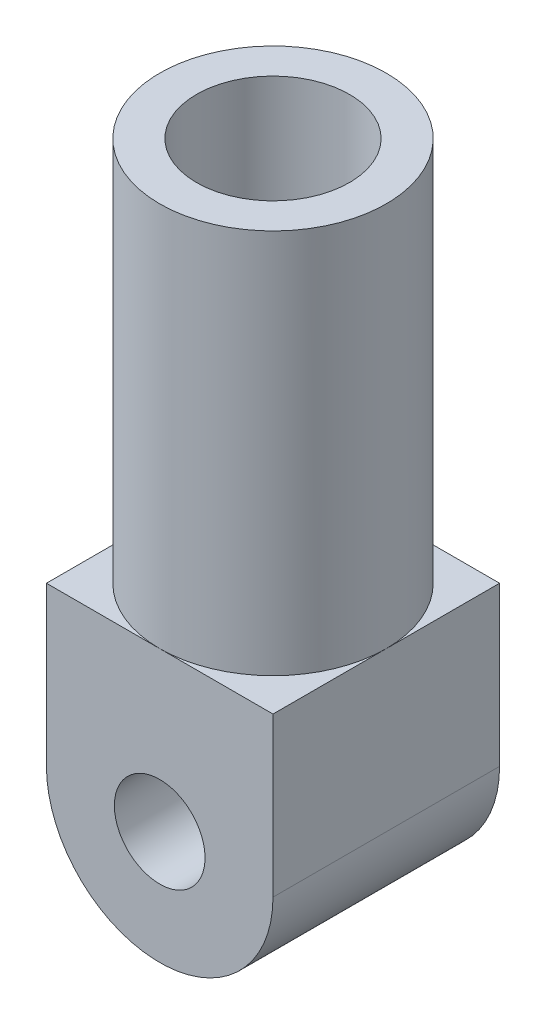
ISO-10303-21;
HEADER;
FILE_DESCRIPTION(('STEP AP214'),'2;1');
FILE_NAME('part.step','',(''),(''),'','','');
FILE_SCHEMA(('AUTOMOTIVE_DESIGN { 1 0 10303 214 1 1 1 1 }'));
ENDSEC;
DATA;
#1=APPLICATION_CONTEXT('core data for automotive mechanical design processes');
#2=APPLICATION_PROTOCOL_DEFINITION('international standard','automotive_design',2000,#1);
#3=PRODUCT_CONTEXT('',#1,'mechanical');
#4=PRODUCT('Part','Part','',(#3));
#5=PRODUCT_RELATED_PRODUCT_CATEGORY('part','',(#4));
#6=PRODUCT_DEFINITION_FORMATION('','',#4);
#7=PRODUCT_DEFINITION_CONTEXT('part definition',#1,'design');
#8=PRODUCT_DEFINITION('design','',#6,#7);
#9=PRODUCT_DEFINITION_SHAPE('','',#8);
#10=(LENGTH_UNIT() NAMED_UNIT(*) SI_UNIT(.MILLI.,.METRE.));
#11=(NAMED_UNIT(*) PLANE_ANGLE_UNIT() SI_UNIT($,.RADIAN.));
#12=(NAMED_UNIT(*) SI_UNIT($,.STERADIAN.) SOLID_ANGLE_UNIT());
#13=UNCERTAINTY_MEASURE_WITH_UNIT(LENGTH_MEASURE(1.E-05),#10,'distance_accuracy_value','');
#14=(GEOMETRIC_REPRESENTATION_CONTEXT(3) GLOBAL_UNCERTAINTY_ASSIGNED_CONTEXT((#13)) GLOBAL_UNIT_ASSIGNED_CONTEXT((#10,
#11,#12)) REPRESENTATION_CONTEXT('',''));
#15=CARTESIAN_POINT('',(0.,0.,0.));
#16=DIRECTION('',(0.,0.,1.));
#17=DIRECTION('',(1.,0.,0.));
#18=AXIS2_PLACEMENT_3D('',#15,#16,#17);
#19=CARTESIAN_POINT('',(10.,-58.,10.));
#20=DIRECTION('',(-1.,0.,0.));
#21=DIRECTION('',(0.,0.,1.));
#22=AXIS2_PLACEMENT_3D('',#19,#20,#21);
#23=PLANE('',#22);
#24=DIRECTION('',(0.,0.,-1.));
#25=VECTOR('',#24,1.);
#26=CARTESIAN_POINT('',(10.,-48.,24.));
#27=LINE('',#26,#25);
#28=CARTESIAN_POINT('',(9.99999999999999,-48.,-10.));
#29=VERTEX_POINT('',#28);
#30=CARTESIAN_POINT('',(9.99999999999999,-48.,10.));
#31=VERTEX_POINT('',#30);
#32=EDGE_CURVE('E11',#29,#31,#27,.F.);
#33=ORIENTED_EDGE('',*,*,#32,.F.);
#34=DIRECTION('',(0.,1.,0.));
#35=VECTOR('',#34,1.);
#36=CARTESIAN_POINT('',(10.,-58.,-10.));
#37=LINE('',#36,#35);
#38=CARTESIAN_POINT('',(10.,-34.,-10.));
#39=VERTEX_POINT('',#38);
#40=EDGE_CURVE('E108',#29,#39,#37,.T.);
#41=ORIENTED_EDGE('',*,*,#40,.T.);
#42=DIRECTION('',(0.,0.,1.));
#43=VECTOR('',#42,1.);
#44=CARTESIAN_POINT('',(10.,-34.,10.));
#45=LINE('',#44,#43);
#46=CARTESIAN_POINT('',(10.,-34.,0.));
#47=VERTEX_POINT('',#46);
#48=EDGE_CURVE('E154',#39,#47,#45,.T.);
#49=ORIENTED_EDGE('',*,*,#48,.T.);
#50=CARTESIAN_POINT('',(10.,-34.,10.));
#51=VERTEX_POINT('',#50);
#52=EDGE_CURVE('E107',#47,#51,#45,.T.);
#53=ORIENTED_EDGE('',*,*,#52,.T.);
#54=DIRECTION('',(0.,1.,0.));
#55=VECTOR('',#54,1.);
#56=CARTESIAN_POINT('',(10.,-58.,10.));
#57=LINE('',#56,#55);
#58=EDGE_CURVE('E94',#31,#51,#57,.T.);
#59=ORIENTED_EDGE('',*,*,#58,.F.);
#60=EDGE_LOOP('',(#33,#41,#49,#53,#59));
#61=FACE_BOUND('',#60,.T.);
#62=ADVANCED_FACE('F41',(#61),#23,.F.);
#63=CARTESIAN_POINT('',(-10.,-58.,10.));
#64=DIRECTION('',(0.,0.,-1.));
#65=DIRECTION('',(-1.,0.,0.));
#66=AXIS2_PLACEMENT_3D('',#63,#64,#65);
#67=PLANE('',#66);
#68=CARTESIAN_POINT('',(0.,-48.,10.));
#69=DIRECTION('',(0.,0.,-1.));
#70=DIRECTION('',(-1.,0.,0.));
#71=AXIS2_PLACEMENT_3D('',#68,#69,#70);
#72=CIRCLE('',#71,4.);
#73=CARTESIAN_POINT('',(-4.,-48.,10.));
#74=VERTEX_POINT('',#73);
#75=EDGE_CURVE('E136',#74,#74,#72,.T.);
#76=ORIENTED_EDGE('',*,*,#75,.T.);
#77=EDGE_LOOP('',(#76));
#78=FACE_BOUND('',#77,.T.);
#79=CARTESIAN_POINT('',(0.,-48.,10.));
#80=DIRECTION('',(0.,0.,-1.));
#81=DIRECTION('',(-1.,0.,0.));
#82=AXIS2_PLACEMENT_3D('',#79,#80,#81);
#83=CIRCLE('',#82,9.99999999999999);
#84=CARTESIAN_POINT('',(-10.,-48.,10.));
#85=VERTEX_POINT('',#84);
#86=EDGE_CURVE('E55',#31,#85,#83,.T.);
#87=ORIENTED_EDGE('',*,*,#86,.F.);
#88=ORIENTED_EDGE('',*,*,#58,.T.);
#89=DIRECTION('',(-1.,0.,0.));
#90=VECTOR('',#89,1.);
#91=CARTESIAN_POINT('',(-10.,-34.,10.));
#92=LINE('',#91,#90);
#93=CARTESIAN_POINT('',(0.,-34.,10.));
#94=VERTEX_POINT('',#93);
#95=EDGE_CURVE('E63',#51,#94,#92,.T.);
#96=ORIENTED_EDGE('',*,*,#95,.T.);
#97=CARTESIAN_POINT('',(-10.,-34.,10.));
#98=VERTEX_POINT('',#97);
#99=EDGE_CURVE('E156',#94,#98,#92,.T.);
#100=ORIENTED_EDGE('',*,*,#99,.T.);
#101=DIRECTION('',(0.,1.,0.));
#102=VECTOR('',#101,1.);
#103=CARTESIAN_POINT('',(-10.,-58.,10.));
#104=LINE('',#103,#102);
#105=EDGE_CURVE('E96',#85,#98,#104,.T.);
#106=ORIENTED_EDGE('',*,*,#105,.F.);
#107=EDGE_LOOP('',(#87,#88,#96,#100,#106));
#108=FACE_BOUND('',#107,.T.);
#109=ADVANCED_FACE('F92',(#78,#108),#67,.F.);
#110=CARTESIAN_POINT('',(-10.,-58.,-10.));
#111=DIRECTION('',(0.,0.,1.));
#112=DIRECTION('',(1.,0.,0.));
#113=AXIS2_PLACEMENT_3D('',#110,#111,#112);
#114=PLANE('',#113);
#115=CARTESIAN_POINT('',(0.,-48.,-10.));
#116=DIRECTION('',(0.,0.,-1.));
#117=DIRECTION('',(-1.,0.,0.));
#118=AXIS2_PLACEMENT_3D('',#115,#116,#117);
#119=CIRCLE('',#118,4.);
#120=CARTESIAN_POINT('',(-4.,-48.,-10.));
#121=VERTEX_POINT('',#120);
#122=EDGE_CURVE('E284',#121,#121,#119,.T.);
#123=ORIENTED_EDGE('',*,*,#122,.F.);
#124=EDGE_LOOP('',(#123));
#125=FACE_BOUND('',#124,.T.);
#126=ORIENTED_EDGE('',*,*,#40,.F.);
#127=CARTESIAN_POINT('',(0.,-48.,-10.));
#128=DIRECTION('',(0.,0.,1.));
#129=DIRECTION('',(1.,0.,0.));
#130=AXIS2_PLACEMENT_3D('',#127,#128,#129);
#131=CIRCLE('',#130,9.99999999999999);
#132=CARTESIAN_POINT('',(-9.99999999999999,-48.,-10.));
#133=VERTEX_POINT('',#132);
#134=EDGE_CURVE('E98',#133,#29,#131,.T.);
#135=ORIENTED_EDGE('',*,*,#134,.F.);
#136=DIRECTION('',(0.,1.,0.));
#137=VECTOR('',#136,1.);
#138=CARTESIAN_POINT('',(-10.,-58.,-10.));
#139=LINE('',#138,#137);
#140=CARTESIAN_POINT('',(-10.,-34.,-10.));
#141=VERTEX_POINT('',#140);
#142=EDGE_CURVE('E110',#133,#141,#139,.T.);
#143=ORIENTED_EDGE('',*,*,#142,.T.);
#144=DIRECTION('',(1.,0.,0.));
#145=VECTOR('',#144,1.);
#146=CARTESIAN_POINT('',(-10.,-34.,-10.));
#147=LINE('',#146,#145);
#148=CARTESIAN_POINT('',(0.,-34.,-10.));
#149=VERTEX_POINT('',#148);
#150=EDGE_CURVE('E147',#141,#149,#147,.T.);
#151=ORIENTED_EDGE('',*,*,#150,.T.);
#152=EDGE_CURVE('E152',#149,#39,#147,.T.);
#153=ORIENTED_EDGE('',*,*,#152,.T.);
#154=EDGE_LOOP('',(#126,#135,#143,#151,#153));
#155=FACE_BOUND('',#154,.T.);
#156=ADVANCED_FACE('F132',(#125,#155),#114,.F.);
#157=CARTESIAN_POINT('',(-10.,-58.,10.));
#158=DIRECTION('',(1.,0.,0.));
#159=DIRECTION('',(0.,0.,-1.));
#160=AXIS2_PLACEMENT_3D('',#157,#158,#159);
#161=PLANE('',#160);
#162=DIRECTION('',(0.,0.,-1.));
#163=VECTOR('',#162,1.);
#164=CARTESIAN_POINT('',(-10.,-48.,24.));
#165=LINE('',#164,#163);
#166=EDGE_CURVE('E49',#85,#133,#165,.T.);
#167=ORIENTED_EDGE('',*,*,#166,.F.);
#168=ORIENTED_EDGE('',*,*,#105,.T.);
#169=DIRECTION('',(0.,0.,-1.));
#170=VECTOR('',#169,1.);
#171=CARTESIAN_POINT('',(-10.,-34.,10.));
#172=LINE('',#171,#170);
#173=CARTESIAN_POINT('',(-10.,-34.,0.));
#174=VERTEX_POINT('',#173);
#175=EDGE_CURVE('E143',#98,#174,#172,.T.);
#176=ORIENTED_EDGE('',*,*,#175,.T.);
#177=EDGE_CURVE('E97',#174,#141,#172,.T.);
#178=ORIENTED_EDGE('',*,*,#177,.T.);
#179=ORIENTED_EDGE('',*,*,#142,.F.);
#180=EDGE_LOOP('',(#167,#168,#176,#178,#179));
#181=FACE_BOUND('',#180,.T.);
#182=ADVANCED_FACE('F138',(#181),#161,.F.);
#183=CARTESIAN_POINT('',(0.,-34.,0.));
#184=DIRECTION('',(0.,1.,0.));
#185=DIRECTION('',(0.,0.,1.));
#186=AXIS2_PLACEMENT_3D('',#183,#184,#185);
#187=CYLINDRICAL_SURFACE('',#186,10.);
#188=CARTESIAN_POINT('',(0.,-34.,0.));
#189=DIRECTION('',(0.,1.,0.));
#190=DIRECTION('',(0.,0.,1.));
#191=AXIS2_PLACEMENT_3D('',#188,#189,#190);
#192=CIRCLE('',#191,10.);
#193=EDGE_CURVE('E123',#94,#47,#192,.T.);
#194=ORIENTED_EDGE('',*,*,#193,.T.);
#195=EDGE_CURVE('E126',#47,#149,#192,.T.);
#196=ORIENTED_EDGE('',*,*,#195,.T.);
#197=EDGE_CURVE('E149',#149,#174,#192,.T.);
#198=ORIENTED_EDGE('',*,*,#197,.T.);
#199=EDGE_CURVE('E127',#174,#94,#192,.T.);
#200=ORIENTED_EDGE('',*,*,#199,.T.);
#201=EDGE_LOOP('',(#194,#196,#198,#200));
#202=FACE_BOUND('',#201,.T.);
#203=CARTESIAN_POINT('',(0.,0.,0.));
#204=DIRECTION('',(0.,1.,0.));
#205=DIRECTION('',(0.,0.,1.));
#206=AXIS2_PLACEMENT_3D('',#203,#204,#205);
#207=CIRCLE('',#206,10.);
#208=CARTESIAN_POINT('',(0.,0.,10.));
#209=VERTEX_POINT('',#208);
#210=EDGE_CURVE('E120',#209,#209,#207,.T.);
#211=ORIENTED_EDGE('',*,*,#210,.F.);
#212=EDGE_LOOP('',(#211));
#213=FACE_BOUND('',#212,.T.);
#214=ADVANCED_FACE('F43',(#202,#213),#187,.T.);
#215=CARTESIAN_POINT('',(0.,0.,0.));
#216=DIRECTION('',(0.,1.,0.));
#217=DIRECTION('',(0.,0.,1.));
#218=AXIS2_PLACEMENT_3D('',#215,#216,#217);
#219=PLANE('',#218);
#220=CARTESIAN_POINT('',(0.,0.,0.));
#221=DIRECTION('',(0.,1.,0.));
#222=DIRECTION('',(0.,0.,1.));
#223=AXIS2_PLACEMENT_3D('',#220,#221,#222);
#224=CIRCLE('',#223,6.75);
#225=CARTESIAN_POINT('',(0.,0.,6.75));
#226=VERTEX_POINT('',#225);
#227=EDGE_CURVE('E116',#226,#226,#224,.T.);
#228=ORIENTED_EDGE('',*,*,#227,.F.);
#229=EDGE_LOOP('',(#228));
#230=FACE_BOUND('',#229,.T.);
#231=ORIENTED_EDGE('',*,*,#210,.T.);
#232=EDGE_LOOP('',(#231));
#233=FACE_BOUND('',#232,.T.);
#234=ADVANCED_FACE('F193',(#230,#233),#219,.T.);
#235=CARTESIAN_POINT('',(0.,-34.,0.));
#236=DIRECTION('',(0.,1.,0.));
#237=DIRECTION('',(0.,0.,1.));
#238=AXIS2_PLACEMENT_3D('',#235,#236,#237);
#239=CYLINDRICAL_SURFACE('',#238,6.75);
#240=CARTESIAN_POINT('',(0.,-34.,0.));
#241=DIRECTION('',(0.,1.,0.));
#242=DIRECTION('',(0.,0.,1.));
#243=AXIS2_PLACEMENT_3D('',#240,#241,#242);
#244=CIRCLE('',#243,6.75);
#245=CARTESIAN_POINT('',(0.,-34.,6.75));
#246=VERTEX_POINT('',#245);
#247=EDGE_CURVE('E117',#246,#246,#244,.T.);
#248=ORIENTED_EDGE('',*,*,#247,.F.);
#249=EDGE_LOOP('',(#248));
#250=FACE_BOUND('',#249,.T.);
#251=ORIENTED_EDGE('',*,*,#227,.T.);
#252=EDGE_LOOP('',(#251));
#253=FACE_BOUND('',#252,.T.);
#254=ADVANCED_FACE('F191',(#250,#253),#239,.F.);
#255=CARTESIAN_POINT('',(0.,-34.,0.));
#256=DIRECTION('',(0.,-1.,0.));
#257=DIRECTION('',(0.,0.,-1.));
#258=AXIS2_PLACEMENT_3D('',#255,#256,#257);
#259=PLANE('',#258);
#260=ORIENTED_EDGE('',*,*,#199,.F.);
#261=ORIENTED_EDGE('',*,*,#175,.F.);
#262=ORIENTED_EDGE('',*,*,#99,.F.);
#263=EDGE_LOOP('',(#260,#261,#262));
#264=FACE_BOUND('',#263,.T.);
#265=ADVANCED_FACE('F159',(#264),#259,.F.);
#266=ORIENTED_EDGE('',*,*,#197,.F.);
#267=ORIENTED_EDGE('',*,*,#150,.F.);
#268=ORIENTED_EDGE('',*,*,#177,.F.);
#269=EDGE_LOOP('',(#266,#267,#268));
#270=FACE_BOUND('',#269,.T.);
#271=ADVANCED_FACE('F148',(#270),#259,.F.);
#272=ORIENTED_EDGE('',*,*,#195,.F.);
#273=ORIENTED_EDGE('',*,*,#48,.F.);
#274=ORIENTED_EDGE('',*,*,#152,.F.);
#275=EDGE_LOOP('',(#272,#273,#274));
#276=FACE_BOUND('',#275,.T.);
#277=ADVANCED_FACE('F165',(#276),#259,.F.);
#278=ORIENTED_EDGE('',*,*,#193,.F.);
#279=ORIENTED_EDGE('',*,*,#95,.F.);
#280=ORIENTED_EDGE('',*,*,#52,.F.);
#281=EDGE_LOOP('',(#278,#279,#280));
#282=FACE_BOUND('',#281,.T.);
#283=ADVANCED_FACE('F167',(#282),#259,.F.);
#284=ORIENTED_EDGE('',*,*,#247,.T.);
#285=EDGE_LOOP('',(#284));
#286=FACE_BOUND('',#285,.T.);
#287=ADVANCED_FACE('F169',(#286),#259,.F.);
#288=CARTESIAN_POINT('',(0.,-48.,24.));
#289=DIRECTION('',(0.,0.,-1.));
#290=DIRECTION('',(-1.,0.,0.));
#291=AXIS2_PLACEMENT_3D('',#288,#289,#290);
#292=CYLINDRICAL_SURFACE('',#291,9.99999999999999);
#293=ORIENTED_EDGE('',*,*,#86,.T.);
#294=ORIENTED_EDGE('',*,*,#166,.T.);
#295=ORIENTED_EDGE('',*,*,#134,.T.);
#296=ORIENTED_EDGE('',*,*,#32,.T.);
#297=EDGE_LOOP('',(#293,#294,#295,#296));
#298=FACE_BOUND('',#297,.T.);
#299=ADVANCED_FACE('F101',(#298),#292,.T.);
#300=CARTESIAN_POINT('',(0.,-48.,10.));
#301=DIRECTION('',(0.,0.,-1.));
#302=DIRECTION('',(-1.,0.,0.));
#303=AXIS2_PLACEMENT_3D('',#300,#301,#302);
#304=CYLINDRICAL_SURFACE('',#303,4.);
#305=ORIENTED_EDGE('',*,*,#75,.F.);
#306=EDGE_LOOP('',(#305));
#307=FACE_BOUND('',#306,.T.);
#308=ORIENTED_EDGE('',*,*,#122,.T.);
#309=EDGE_LOOP('',(#308));
#310=FACE_BOUND('',#309,.T.);
#311=ADVANCED_FACE('F260',(#307,#310),#304,.F.);
#312=CLOSED_SHELL('',(#62,#109,#156,#182,#214,#234,#254,#265,#271,#277,#283,#287,#299,#311));
#313=MANIFOLD_SOLID_BREP('B2',#312);
#314=ADVANCED_BREP_SHAPE_REPRESENTATION('',(#18,#313),#14);
#315=SHAPE_DEFINITION_REPRESENTATION(#9,#314);
ENDSEC;
END-ISO-10303-21;
